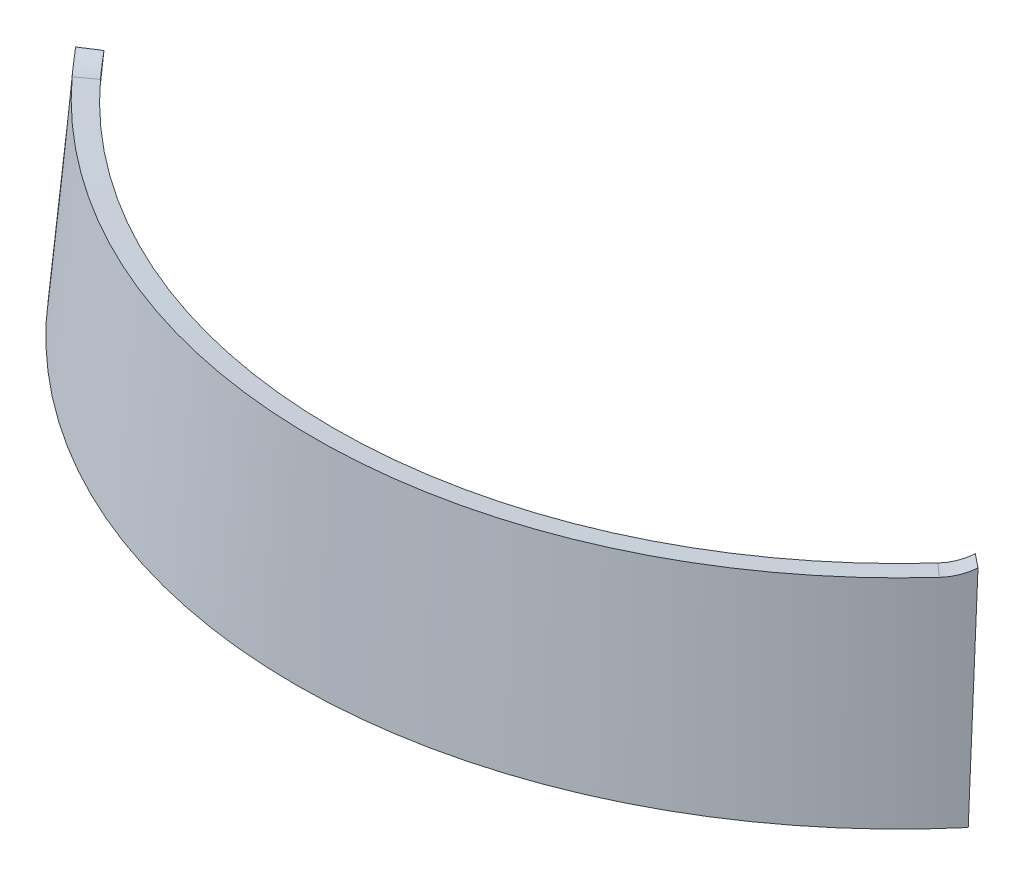
ISO-10303-21;
HEADER;
FILE_DESCRIPTION(('STEP AP214'),'2;1');
FILE_NAME('part.step','',(''),(''),'','','');
FILE_SCHEMA(('AUTOMOTIVE_DESIGN { 1 0 10303 214 1 1 1 1 }'));
ENDSEC;
DATA;
#1=APPLICATION_CONTEXT('core data for automotive mechanical design processes');
#2=APPLICATION_PROTOCOL_DEFINITION('international standard','automotive_design',2000,#1);
#3=PRODUCT_CONTEXT('',#1,'mechanical');
#4=PRODUCT('Part','Part','',(#3));
#5=PRODUCT_RELATED_PRODUCT_CATEGORY('part','',(#4));
#6=PRODUCT_DEFINITION_FORMATION('','',#4);
#7=PRODUCT_DEFINITION_CONTEXT('part definition',#1,'design');
#8=PRODUCT_DEFINITION('design','',#6,#7);
#9=PRODUCT_DEFINITION_SHAPE('','',#8);
#10=(LENGTH_UNIT() NAMED_UNIT(*) SI_UNIT(.MILLI.,.METRE.));
#11=(NAMED_UNIT(*) PLANE_ANGLE_UNIT() SI_UNIT($,.RADIAN.));
#12=(NAMED_UNIT(*) SI_UNIT($,.STERADIAN.) SOLID_ANGLE_UNIT());
#13=UNCERTAINTY_MEASURE_WITH_UNIT(LENGTH_MEASURE(1.E-05),#10,'distance_accuracy_value','');
#14=(GEOMETRIC_REPRESENTATION_CONTEXT(3) GLOBAL_UNCERTAINTY_ASSIGNED_CONTEXT((#13)) GLOBAL_UNIT_ASSIGNED_CONTEXT((#10,
#11,#12)) REPRESENTATION_CONTEXT('',''));
#15=CARTESIAN_POINT('',(0.,0.,0.));
#16=DIRECTION('',(0.,0.,1.));
#17=DIRECTION('',(1.,0.,0.));
#18=AXIS2_PLACEMENT_3D('',#15,#16,#17);
#19=CARTESIAN_POINT('',(58.3,-59.3935778713701,-83.337));
#20=DIRECTION('',(0.,-1.,0.));
#21=DIRECTION('',(0.,0.,-1.));
#22=AXIS2_PLACEMENT_3D('',#19,#20,#21);
#23=CONICAL_SURFACE('',#22,14.4850002191191,0.0872664625997009);
#24=CARTESIAN_POINT('',(69.3358035425654,-59.3935778713701,-73.9547683082445));
#25=CARTESIAN_POINT('',(69.3278254439968,-59.2081544183625,-73.9704296287934));
#26=CARTESIAN_POINT('',(69.3198754261002,-59.022733099519,-73.9861308660555));
#27=CARTESIAN_POINT('',(69.304057985451,-58.6518968010558,-74.017645272451));
#28=CARTESIAN_POINT('',(69.2961905625463,-58.466481821425,-74.0334584413782));
#29=CARTESIAN_POINT('',(69.2811196343292,-58.1088285409578,-74.0641006088641));
#30=CARTESIAN_POINT('',(69.2739086621952,-57.9365897108178,-74.0789197369238));
#31=CARTESIAN_POINT('',(69.2596113194375,-57.5921208480425,-74.108719532648));
#32=CARTESIAN_POINT('',(69.2525249488231,-57.4198908154078,-74.1237002003246));
#33=CARTESIAN_POINT('',(69.2313665790193,-56.9032088408956,-74.1687851908158));
#34=CARTESIAN_POINT('',(69.2173953329085,-56.5587652869665,-74.1990324783015));
#35=CARTESIAN_POINT('',(69.1961715909945,-56.0420877292742,-74.2441349558342));
#36=CARTESIAN_POINT('',(69.1890525384911,-55.869860003387,-74.259124358543));
#37=CARTESIAN_POINT('',(69.1746899767129,-55.5253981906983,-74.2889701613383));
#38=CARTESIAN_POINT('',(69.1674464674176,-55.3531641038958,-74.3038265614027));
#39=CARTESIAN_POINT('',(69.1528708069899,-55.0086917295785,-74.3334482550356));
#40=CARTESIAN_POINT('',(69.1455386557888,-54.8364534420606,-74.3482135485335));
#41=CARTESIAN_POINT('',(69.1308083099753,-54.4919742102006,-74.3776795504364));
#42=CARTESIAN_POINT('',(69.1234101153807,-54.3197332658594,-74.3923802588588));
#43=CARTESIAN_POINT('',(69.115990193567,-54.1474916520135,-74.4070619452131));
#44=B_SPLINE_CURVE_WITH_KNOTS('',3,(#24,#25,#26,#27,#28,#29,#30,#31,#32,#33,#34,#35,#36,#37,#38,
#39,#40,#41,#42,#43),.UNSPECIFIED.,.F.,.F.,(4,2,2,2,2,2,2,2,2,4),(0.,0.558763899898787,
1.11752677006218,1.63660312289222,2.15567951426087,3.19383309429425,3.71290889291727,
4.23198477770737,4.75106106518763,5.2701372133416),.UNSPECIFIED.);
#45=CARTESIAN_POINT('',(69.3358035425856,-59.3935778713684,-73.9547683082263));
#46=VERTEX_POINT('',#45);
#47=CARTESIAN_POINT('',(69.1159901935664,-54.1474916520136,-74.4070619452123));
#48=VERTEX_POINT('',#47);
#49=EDGE_CURVE('E162',#46,#48,#44,.T.);
#50=ORIENTED_EDGE('',*,*,#49,.F.);
#51=CARTESIAN_POINT('',(58.3,-59.3935778713668,-83.337));
#52=DIRECTION('',(0.,1.,0.));
#53=DIRECTION('',(-0.761854898052408,0.,0.647747724282807));
#54=AXIS2_PLACEMENT_3D('',#51,#52,#53);
#55=CIRCLE('',#54,14.4850002191197);
#56=CARTESIAN_POINT('',(47.2645316983138,-59.3935763446305,-73.9543742033071));
#57=VERTEX_POINT('',#56);
#58=EDGE_CURVE('E88',#57,#46,#55,.T.);
#59=ORIENTED_EDGE('',*,*,#58,.F.);
#60=CARTESIAN_POINT('',(47.4840410216355,-54.1472884243641,-74.4070520640063));
#61=CARTESIAN_POINT('',(47.4762288302436,-54.3328111733335,-74.3910207160033));
#62=CARTESIAN_POINT('',(47.4683394030358,-54.5183393050994,-74.375090755471));
#63=CARTESIAN_POINT('',(47.4525193306691,-54.8893995654095,-74.3432975043379));
#64=CARTESIAN_POINT('',(47.4445886855037,-55.0749316939544,-74.3274342137474));
#65=CARTESIAN_POINT('',(47.4287994293599,-55.4459932163226,-74.2956381942466));
#66=CARTESIAN_POINT('',(47.4209408184184,-55.6315226101446,-74.2797054653005));
#67=CARTESIAN_POINT('',(47.405434893005,-56.0025699856358,-74.2476059316552));
#68=CARTESIAN_POINT('',(47.3977875785231,-56.1880879673054,-74.231439126967));
#69=CARTESIAN_POINT('',(47.3798967557662,-56.6252512200588,-74.1932104178857));
#70=CARTESIAN_POINT('',(47.3696995639063,-56.8768942435226,-74.1711014777819));
#71=CARTESIAN_POINT('',(47.3542996040209,-57.254367601149,-74.1380870001985));
#72=CARTESIAN_POINT('',(47.3491489221781,-57.3801935208312,-74.1271069967157));
#73=CARTESIAN_POINT('',(47.3387625088909,-57.6318512626583,-74.1052554680019));
#74=CARTESIAN_POINT('',(47.3335267774617,-57.7576830848021,-74.0943839427513));
#75=CARTESIAN_POINT('',(47.3177077097769,-58.1351864638156,-74.0619122059468));
#76=CARTESIAN_POINT('',(47.3070125149735,-58.3868655686079,-74.040454865262));
#77=CARTESIAN_POINT('',(47.2856598393778,-58.8902246435601,-73.9975250037979));
#78=CARTESIAN_POINT('',(47.2750023586706,-59.1419046137207,-73.9760524829845));
#79=CARTESIAN_POINT('',(47.2645317618514,-59.3935748178942,-73.9543743347868));
#80=B_SPLINE_CURVE_WITH_KNOTS('',3,(#60,#61,#62,#63,#64,#65,#66,#67,#68,#69,#70,#71,#72,#73,#74,
#75,#76,#77,#78,#79),.UNSPECIFIED.,.F.,.F.,(4,2,2,2,2,2,2,2,2,4),(0.,0.559133523831722,
1.1182671351707,1.67740103398555,2.23653490659354,2.99498925711462,3.37421641269476,
3.75344349955008,4.51189877232273,5.27035575500386),.UNSPECIFIED.);
#81=CARTESIAN_POINT('',(47.4840342655292,-54.1474488852611,-74.407038197131));
#82=VERTEX_POINT('',#81);
#83=EDGE_CURVE('E86',#82,#57,#80,.T.);
#84=ORIENTED_EDGE('',*,*,#83,.F.);
#85=CARTESIAN_POINT('',(47.4839237497308,-54.1473506355896,-74.4071855567713));
#86=CARTESIAN_POINT('',(47.5029455469849,-54.1642915044753,-74.3818157854818));
#87=CARTESIAN_POINT('',(47.5226190392376,-54.1798309830475,-74.3560216232284));
#88=CARTESIAN_POINT('',(47.5630832073092,-54.2081477801977,-74.303837424383));
#89=CARTESIAN_POINT('',(47.5838729736652,-54.2209273060048,-74.2774478827322));
#90=CARTESIAN_POINT('',(47.6279955313779,-54.2446415568394,-74.2223086545942));
#91=CARTESIAN_POINT('',(47.6514024858307,-54.2553685683181,-74.1935293324321));
#92=CARTESIAN_POINT('',(47.6991530615057,-54.2737792228586,-74.1357528868523));
#93=CARTESIAN_POINT('',(47.7234971409555,-54.2814613557788,-74.1067556626097));
#94=CARTESIAN_POINT('',(47.7736296113362,-54.2939388824095,-74.0479702507079));
#95=CARTESIAN_POINT('',(47.799439307796,-54.2986491693966,-74.0181822192949));
#96=CARTESIAN_POINT('',(47.8517056582418,-54.3049019665824,-73.9587979989549));
#97=CARTESIAN_POINT('',(47.8781628157602,-54.3064419265174,-73.9292019835493));
#98=CARTESIAN_POINT('',(47.9048424092805,-54.306422128634,-73.8998191419885));
#99=B_SPLINE_CURVE_WITH_KNOTS('',3,(#85,#86,#87,#88,#89,#90,#91,#92,#93,#94,#95,#96,#97,#98),
.UNSPECIFIED.,.F.,.F.,(4,2,2,2,2,2,4),(0.,0.107792435970716,0.215498344754158,0.331209552811007,
0.446978077543321,0.565927150362218,0.684971870455319),.UNSPECIFIED.);
#100=CARTESIAN_POINT('',(47.9048424092813,-54.3064221286304,-73.8998191419883));
#101=VERTEX_POINT('',#100);
#102=EDGE_CURVE('E24',#82,#101,#99,.T.);
#103=ORIENTED_EDGE('',*,*,#102,.T.);
#104=CARTESIAN_POINT('',(58.3,-54.3064221286268,-83.337));
#105=DIRECTION('',(0.,1.,0.));
#106=DIRECTION('',(-0.740399438323832,0.,0.672167145678628));
#107=AXIS2_PLACEMENT_3D('',#104,#105,#106);
#108=CIRCLE('',#107,14.0399317620397);
#109=CARTESIAN_POINT('',(68.6951575964687,-54.3064221286267,-73.8998191483213));
#110=VERTEX_POINT('',#109);
#111=EDGE_CURVE('E188',#101,#110,#108,.T.);
#112=ORIENTED_EDGE('',*,*,#111,.T.);
#113=CARTESIAN_POINT('',(68.6951575964682,-54.3064221286267,-73.8998191483217));
#114=CARTESIAN_POINT('',(68.7222247042246,-54.3064413533519,-73.9296287306348));
#115=CARTESIAN_POINT('',(68.7490638326719,-54.3048555116502,-73.9596589626375));
#116=CARTESIAN_POINT('',(68.8020703407169,-54.2984165120459,-74.019911881253));
#117=CARTESIAN_POINT('',(68.8282382959003,-54.2935662580097,-74.0501343731928));
#118=CARTESIAN_POINT('',(68.8773217391302,-54.281151973593,-74.10774375126));
#119=CARTESIAN_POINT('',(68.900312168743,-54.2738849570193,-74.1351308729946));
#120=CARTESIAN_POINT('',(68.9454613768772,-54.2566376495181,-74.1897160229447));
#121=CARTESIAN_POINT('',(68.9676205091897,-54.2466585280897,-74.2169141274947));
#122=CARTESIAN_POINT('',(69.0115567859944,-54.2236352271577,-74.2716721861941));
#123=CARTESIAN_POINT('',(69.0333072472861,-54.2105152218121,-74.2992219315312));
#124=CARTESIAN_POINT('',(69.0756066499725,-54.1812744067909,-74.3536899738121));
#125=CARTESIAN_POINT('',(69.0961543945257,-54.1651506726031,-74.3806076263246));
#126=CARTESIAN_POINT('',(69.1159901935657,-54.1474916520142,-74.4070619452114));
#127=B_SPLINE_CURVE_WITH_KNOTS('',3,(#113,#114,#115,#116,#117,#118,#119,#120,#121,#122,#123,
#124,#125,#126),.UNSPECIFIED.,.F.,.F.,(4,2,2,2,2,2,4),(0.,0.120775992712592,0.241444690579032,
0.350801760817208,0.460111749302712,0.572388002950398,0.684774148610695),.UNSPECIFIED.);
#128=EDGE_CURVE('E157',#110,#48,#127,.T.);
#129=ORIENTED_EDGE('',*,*,#128,.T.);
#130=EDGE_LOOP('',(#50,#59,#84,#103,#112,#129));
#131=FACE_BOUND('',#130,.T.);
#132=ADVANCED_FACE('F17',(#131),#23,.F.);
#133=CARTESIAN_POINT('',(47.49866165339,-54.14282071276,-74.43629063863));
#134=CARTESIAN_POINT('',(47.35546964124,-54.12658763615,-74.31829503079));
#135=CARTESIAN_POINT('',(47.21227762908,-54.11035455955,-74.20029942295));
#136=CARTESIAN_POINT('',(47.06908561693,-54.09412148294,-74.08230381511));
#137=CARTESIAN_POINT('',(47.50129625758,-54.14524329011,-74.4327601891));
#138=CARTESIAN_POINT('',(47.35814135449,-54.12901021503,-74.31471957698));
#139=CARTESIAN_POINT('',(47.21498645141,-54.11277713996,-74.19667896487));
#140=CARTESIAN_POINT('',(47.07183154832,-54.09654406489,-74.07863835275));
#141=CARTESIAN_POINT('',(47.54204445549,-54.18212421184,-74.37828670634));
#142=CARTESIAN_POINT('',(47.39946292522,-54.16589115793,-74.25955134016));
#143=CARTESIAN_POINT('',(47.25688139494,-54.14965810402,-74.14081597399));
#144=CARTESIAN_POINT('',(47.11429986467,-54.13342505011,-74.02208060782));
#145=CARTESIAN_POINT('',(47.62686881689,-54.24145863301,-74.26879254677));
#146=CARTESIAN_POINT('',(47.48546385033,-54.22522555237,-74.14865016815));
#147=CARTESIAN_POINT('',(47.34405888376,-54.20899247172,-74.02850778952));
#148=CARTESIAN_POINT('',(47.2026539172,-54.19275939108,-73.9083654109));
#149=CARTESIAN_POINT('',(47.76808444808,-54.29615050013,-74.09776282732));
#150=CARTESIAN_POINT('',(47.62859804782,-54.27991742976,-73.9753965471));
#151=CARTESIAN_POINT('',(47.48911164756,-54.26368435939,-73.85303026688));
#152=CARTESIAN_POINT('',(47.3496252473,-54.24745128902,-73.73066398666));
#153=CARTESIAN_POINT('',(47.87490546618,-54.30935962691,-73.97622827808));
#154=CARTESIAN_POINT('',(47.7368450353,-54.29312655493,-73.85226276934));
#155=CARTESIAN_POINT('',(47.59878460443,-54.27689348295,-73.7282972606));
#156=CARTESIAN_POINT('',(47.46072417356,-54.26066041098,-73.60433175186));
#157=CARTESIAN_POINT('',(47.93293964588,-54.30896067019,-73.91241988732));
#158=CARTESIAN_POINT('',(47.79564742111,-54.29272759765,-73.78760904158));
#159=CARTESIAN_POINT('',(47.65835519634,-54.27649452512,-73.66279819583));
#160=CARTESIAN_POINT('',(47.52106297157,-54.26026145259,-73.53798735009));
#161=CARTESIAN_POINT('',(47.93616740072,-54.30891632902,-73.90887748992));
#162=CARTESIAN_POINT('',(47.79891788321,-54.29268325646,-73.78401969699));
#163=CARTESIAN_POINT('',(47.6616683657,-54.2764501839,-73.65916190406));
#164=CARTESIAN_POINT('',(47.52441884818,-54.26021711133,-73.53430411113));
#165=B_SPLINE_SURFACE_WITH_KNOTS('',3,3,((#133,#134,#135,#136),(#137,#138,#139,#140),(#141,#142,
#143,#144),(#145,#146,#147,#148),(#149,#150,#151,#152),(#153,#154,#155,#156),(#157,#158,#159,
#160),(#161,#162,#163,#164)),.UNSPECIFIED.,.F.,.F.,.F.,(4,1,1,1,1,4),(4,4),(0.206989552427,
0.2203666454819,0.4128770567948,0.6053874681078,0.7978978794207,0.8091998105001),
(0.3067286010984,0.6932713250124),.UNSPECIFIED.);
#166=CARTESIAN_POINT('',(47.5360507043638,-54.2628442572614,-73.5650152478724));
#167=CARTESIAN_POINT('',(47.5070678673985,-54.2628667672145,-73.5969342815541));
#168=CARTESIAN_POINT('',(47.4783330896156,-54.2611709628598,-73.6290948539875));
#169=CARTESIAN_POINT('',(47.421550154133,-54.2542744411859,-73.6936782619392));
#170=CARTESIAN_POINT('',(47.3935024176215,-54.2490716270109,-73.7261012428873));
#171=CARTESIAN_POINT('',(47.3422767492567,-54.2360951286395,-73.7862992131596));
#172=CARTESIAN_POINT('',(47.3189773481617,-54.2287972228289,-73.8140738468884));
#173=CARTESIAN_POINT('',(47.273183049476,-54.2115760124794,-73.8694506685729));
#174=CARTESIAN_POINT('',(47.2506877674617,-54.2016539820328,-73.8970529335794));
#175=CARTESIAN_POINT('',(47.2060895186944,-54.1788390232417,-73.9525929610576));
#176=CARTESIAN_POINT('',(47.1840100645715,-54.1658786050726,-73.9805221031898));
#177=CARTESIAN_POINT('',(47.1409996131213,-54.1370370695421,-74.0357996564438));
#178=CARTESIAN_POINT('',(47.120069816095,-54.1211529722367,-74.0631474430076));
#179=CARTESIAN_POINT('',(47.0998195769672,-54.1037732585963,-74.0900657108391));
#180=B_SPLINE_CURVE_WITH_KNOTS('',3,(#166,#167,#168,#169,#170,#171,#172,#173,#174,#175,#176,
#177,#178,#179),.UNSPECIFIED.,.F.,.F.,(4,2,2,2,2,2,4),(0.,0.129325554555336,0.258728502064069,
0.369571014512206,0.480359808042097,0.593892320507051,0.707541197669691),.UNSPECIFIED.);
#181=CARTESIAN_POINT('',(47.5360505864559,-54.2628442572569,-73.5650153777482));
#182=VERTEX_POINT('',#181);
#183=CARTESIAN_POINT('',(47.0999336781498,-54.1038710141412,-74.089914080989));
#184=VERTEX_POINT('',#183);
#185=EDGE_CURVE('E187',#182,#184,#180,.T.);
#186=CARTESIAN_POINT('',(47.5360514118123,-54.2628442572523,-73.5650144686047));
#187=CARTESIAN_POINT('',(47.5514177800969,-54.2646600018929,-73.5789645788172));
#188=CARTESIAN_POINT('',(47.5667841278617,-54.2664757465335,-73.5929147116328));
#189=CARTESIAN_POINT('',(47.5975167852724,-54.2701072358147,-73.6208150192521));
#190=CARTESIAN_POINT('',(47.6128830949185,-54.2719229804553,-73.6347651940559));
#191=CARTESIAN_POINT('',(47.6436156790133,-54.2755544697365,-73.6626655824336));
#192=CARTESIAN_POINT('',(47.6589819534621,-54.2773702143772,-73.6766157960075));
#193=CARTESIAN_POINT('',(47.6897144554812,-54.2810017036584,-73.7045162747924));
#194=CARTESIAN_POINT('',(47.7050806830515,-54.282817448299,-73.7184665400034));
#195=CARTESIAN_POINT('',(47.7362147527422,-54.286496394234,-73.7467316774264));
#196=CARTESIAN_POINT('',(47.7519825948587,-54.2883595955283,-73.7610465496427));
#197=CARTESIAN_POINT('',(47.7832505843989,-54.2920543603479,-73.7894331694938));
#198=CARTESIAN_POINT('',(47.7987507310001,-54.2938859238731,-73.8035049180345));
#199=CARTESIAN_POINT('',(47.829483316386,-54.2975174131543,-73.83140530499));
#200=CARTESIAN_POINT('',(47.8447157545465,-54.2993173389103,-73.8452339440924));
#201=CARTESIAN_POINT('',(47.874912925098,-54.3028855526532,-73.8726481099165));
#202=CARTESIAN_POINT('',(47.8898776568069,-54.3046538406401,-73.8862336373896));
#203=CARTESIAN_POINT('',(47.9048424092821,-54.3064221286269,-73.8998191419881));
#204=B_SPLINE_CURVE_WITH_KNOTS('',3,(#186,#187,#188,#189,#190,#191,#192,#193,#194,#195,#196,
#197,#198,#199,#200,#201,#202,#203),.UNSPECIFIED.,.F.,.F.,(4,2,2,2,2,2,2,2,4),(0.,
0.0625000000014957,0.125000000002516,0.187500000003562,0.250000000005036,0.314133512116847,
0.377178016154641,0.439133512118844,0.500000000009961),.UNSPECIFIED.);
#205=EDGE_CURVE('E83',#182,#101,#204,.T.);
#206=CARTESIAN_POINT('',(47.0999336803682,-54.1038710143917,-74.0899140828206));
#207=CARTESIAN_POINT('',(47.1357053226429,-54.1079294617564,-74.1194481445009));
#208=CARTESIAN_POINT('',(47.1714769649176,-54.1119879091211,-74.1489822061812));
#209=CARTESIAN_POINT('',(47.2430202494668,-54.1201048038509,-74.2080503295419));
#210=CARTESIAN_POINT('',(47.2787918917414,-54.1241632512159,-74.2375843912223));
#211=CARTESIAN_POINT('',(47.3710687813788,-54.1346324630218,-74.313770754972));
#212=CARTESIAN_POINT('',(47.4275740287415,-54.1410432274631,-74.3604230570415));
#213=CARTESIAN_POINT('',(47.4840792761035,-54.1474539919052,-74.4070753591116));
#214=B_SPLINE_CURVE_WITH_KNOTS('',3,(#206,#207,#208,#209,#210,#211,#212,#213),.UNSPECIFIED.,.F.,
.F.,(4,2,2,4),(0.,0.139696383877267,0.279392767754503,0.500058586397932),.UNSPECIFIED.);
#215=EDGE_CURVE('E80',#184,#82,#214,.T.);
#216=ORIENTED_EDGE('',*,*,#185,.F.);
#217=ORIENTED_EDGE('',*,*,#205,.T.);
#218=ORIENTED_EDGE('',*,*,#102,.F.);
#219=ORIENTED_EDGE('',*,*,#215,.F.);
#220=EDGE_LOOP('',(#216,#217,#218,#219));
#221=FACE_BOUND('',#220,.T.);
#222=ADVANCED_FACE('F78',(#221),#165,.F.);
#223=CARTESIAN_POINT('',(47.50901228822,-54.09761392571,-74.43036734651));
#224=CARTESIAN_POINT('',(47.36584777773,-54.08137329344,-74.31220265738));
#225=CARTESIAN_POINT('',(47.22268326725,-54.06513266118,-74.19403796825));
#226=CARTESIAN_POINT('',(47.07951875677,-54.04889202891,-74.07587327912));
#227=CARTESIAN_POINT('',(47.5082791736,-54.11508838487,-74.42885823734));
#228=CARTESIAN_POINT('',(47.36511980554,-54.09884766802,-74.31068579934));
#229=CARTESIAN_POINT('',(47.22196043747,-54.08260695117,-74.19251336134));
#230=CARTESIAN_POINT('',(47.0788010694,-54.06636623432,-74.07434092334));
#231=CARTESIAN_POINT('',(47.48284844713,-54.72055586039,-74.37660040719));
#232=CARTESIAN_POINT('',(47.33986804891,-54.70431234841,-74.25816098834));
#233=CARTESIAN_POINT('',(47.19688765069,-54.68806883644,-74.13972156949));
#234=CARTESIAN_POINT('',(47.05390725247,-54.67182532447,-74.02128215064));
#235=CARTESIAN_POINT('',(47.43098997216,-55.910590408,-74.2758651083));
#236=CARTESIAN_POINT('',(47.28841413433,-55.89435034868,-74.15699980953));
#237=CARTESIAN_POINT('',(47.1458382965,-55.87811028936,-74.03813451076));
#238=CARTESIAN_POINT('',(47.00326245866,-55.86187023005,-73.91926921199));
#239=CARTESIAN_POINT('',(47.3612980963,-57.65908009802,-74.12086258553));
#240=CARTESIAN_POINT('',(47.21934436836,-57.64284025142,-74.00125886501));
#241=CARTESIAN_POINT('',(47.07739064041,-57.62660040482,-73.88165514448));
#242=CARTESIAN_POINT('',(46.93543691247,-57.61036055822,-73.76205142395));
#243=CARTESIAN_POINT('',(47.31042653596,-58.83585042074,-74.02182124519));
#244=CARTESIAN_POINT('',(47.16879408879,-58.81960654469,-73.90176679616));
#245=CARTESIAN_POINT('',(47.02716164161,-58.80336266864,-73.78171234713));
#246=CARTESIAN_POINT('',(46.88552919444,-58.78711879259,-73.66165789811));
#247=CARTESIAN_POINT('',(47.28557198541,-59.43115899253,-73.97048941471));
#248=CARTESIAN_POINT('',(47.14415860975,-59.41491830082,-73.8502335197));
#249=CARTESIAN_POINT('',(47.00274523409,-59.3986776091,-73.72997762468));
#250=CARTESIAN_POINT('',(46.86133185843,-59.38243691739,-73.60972172967));
#251=CARTESIAN_POINT('',(47.28484232368,-59.4486551091,-73.96897963936));
#252=CARTESIAN_POINT('',(47.14343543768,-59.43241451567,-73.84871784726));
#253=CARTESIAN_POINT('',(47.00202855168,-59.41617392223,-73.72845605515));
#254=CARTESIAN_POINT('',(46.86062166567,-59.3999333288,-73.60819426304));
#255=B_SPLINE_SURFACE_WITH_KNOTS('',3,3,((#223,#224,#225,#226),(#227,#228,#229,#230),(#231,#232,
#233,#234),(#235,#236,#237,#238),(#239,#240,#241,#242),(#243,#244,#245,#246),(#247,#248,#249,
#250),(#251,#252,#253,#254)),.UNSPECIFIED.,.F.,.F.,.F.,(4,1,1,1,1,4),(4,4),(0.03203523281385,
0.04111895044176,0.3468003726751,0.6524817949085,0.9581632171418,0.9674201014717),
(0.306542843676,0.6932713753543),.UNSPECIFIED.);
#256=CARTESIAN_POINT('',(46.8850537311856,-59.3500000001638,-73.6317326487801));
#257=CARTESIAN_POINT('',(46.9204168597358,-59.3540609740616,-73.6617992482069));
#258=CARTESIAN_POINT('',(46.9557799882857,-59.3581219479595,-73.691865847634));
#259=CARTESIAN_POINT('',(47.0265062453854,-59.3662438957551,-73.7519990464886));
#260=CARTESIAN_POINT('',(47.0618693739351,-59.3703048696529,-73.7820656459161));
#261=CARTESIAN_POINT('',(47.1530119963304,-59.3807713590645,-73.8595573394033));
#262=CARTESIAN_POINT('',(47.208791490176,-59.3871768745783,-73.906982433463));
#263=CARTESIAN_POINT('',(47.2645709840224,-59.3935823900921,-73.954407527522));
#264=B_SPLINE_CURVE_WITH_KNOTS('',3,(#256,#257,#258,#259,#260,#261,#262,#263),.UNSPECIFIED.,.F.,
.F.,(4,2,2,4),(0.,0.139783350004785,0.279566700009595,0.500051844595891),.UNSPECIFIED.);
#265=CARTESIAN_POINT('',(46.8849749986281,-59.3499984631999,-73.6318254584485));
#266=VERTEX_POINT('',#265);
#267=EDGE_CURVE('E92',#266,#57,#264,.T.);
#268=CARTESIAN_POINT('',(47.0999400331399,-54.1037167267381,-74.0899275808074));
#269=CARTESIAN_POINT('',(47.0922953248626,-54.2892289511036,-74.0736948339414));
#270=CARTESIAN_POINT('',(47.0845700976722,-54.474746961953,-74.0575676994378));
#271=CARTESIAN_POINT('',(47.0690758324073,-54.8457873015414,-74.0253838027863));
#272=CARTESIAN_POINT('',(47.0613067943259,-55.0313096302812,-74.0093270406496));
#273=CARTESIAN_POINT('',(47.0458421326412,-55.4023513895955,-73.9771430329331));
#274=CARTESIAN_POINT('',(47.0381465090767,-55.5878708201684,-73.9610157873161));
#275=CARTESIAN_POINT('',(47.0229727720224,-55.9588974965848,-73.9285204965951));
#276=CARTESIAN_POINT('',(47.0154946585231,-56.1444047424288,-73.9121524515017));
#277=CARTESIAN_POINT('',(46.9980048783917,-56.5815652107842,-73.8734444608926));
#278=CARTESIAN_POINT('',(46.9880407024062,-56.833216039477,-73.8510563793326));
#279=CARTESIAN_POINT('',(46.9729851349576,-57.2107017741041,-73.817630120684));
#280=CARTESIAN_POINT('',(46.9679483954014,-57.3365319300012,-73.806514012122));
#281=CARTESIAN_POINT('',(46.9577864024745,-57.5881985768051,-73.7843946177131));
#282=CARTESIAN_POINT('',(46.9526611491212,-57.7140350677108,-73.7733913318443));
#283=CARTESIAN_POINT('',(46.9371688182205,-58.0915530545995,-73.7405301935137));
#284=CARTESIAN_POINT('',(46.9266851860513,-58.3432426573091,-73.7188210964394));
#285=CARTESIAN_POINT('',(46.9057548962458,-58.8466228633725,-73.6753895977375));
#286=CARTESIAN_POINT('',(46.8953082387004,-59.0983134667273,-73.6536671960774));
#287=CARTESIAN_POINT('',(46.8850539887345,-59.3499936440686,-73.6317332013084));
#288=B_SPLINE_CURVE_WITH_KNOTS('',3,(#268,#269,#270,#271,#272,#273,#274,#275,#276,#277,#278,
#279,#280,#281,#282,#283,#284,#285,#286,#287),.UNSPECIFIED.,.F.,.F.,(4,2,2,2,2,2,2,2,2,4),(0.,
0.559133539850394,1.11826716859833,1.67740109275695,2.23653499262418,2.99505846936875,
3.37432018216237,3.75358182081141,4.51210632619713,5.27063269293057),.UNSPECIFIED.);
#289=EDGE_CURVE('E96',#184,#266,#288,.T.);
#290=ORIENTED_EDGE('',*,*,#215,.T.);
#291=ORIENTED_EDGE('',*,*,#83,.T.);
#292=ORIENTED_EDGE('',*,*,#267,.F.);
#293=ORIENTED_EDGE('',*,*,#289,.F.);
#294=EDGE_LOOP('',(#290,#291,#292,#293));
#295=FACE_BOUND('',#294,.T.);
#296=ADVANCED_FACE('F94',(#295),#255,.T.);
#297=CARTESIAN_POINT('',(58.3,-59.3499999999925,-83.337));
#298=DIRECTION('',(0.,1.,0.));
#299=DIRECTION('',(0.,0.,1.));
#300=AXIS2_PLACEMENT_3D('',#297,#298,#299);
#301=CONICAL_SURFACE('',#300,14.9830975681693,1.4835298641949);
#302=DIRECTION('',(-0.758978861722535,-0.0871557427438048,-0.645255735321385));
#303=VECTOR('',#302,1.);
#304=CARTESIAN_POINT('',(69.5255482579946,-59.3717889356856,-73.7934543744134));
#305=LINE('',#304,#303);
#306=CARTESIAN_POINT('',(69.7152929734215,-59.3499999999997,-73.6321404405799));
#307=VERTEX_POINT('',#306);
#308=EDGE_CURVE('E168',#307,#46,#305,.T.);
#309=ORIENTED_EDGE('',*,*,#308,.F.);
#310=CARTESIAN_POINT('',(58.3,-59.3499999999999,-83.337));
#311=DIRECTION('',(0.,-1.,0.));
#312=DIRECTION('',(0.,0.,-1.));
#313=AXIS2_PLACEMENT_3D('',#310,#311,#312);
#314=CIRCLE('',#313,14.9830975681683);
#315=EDGE_CURVE('E180',#266,#307,#314,.F.);
#316=ORIENTED_EDGE('',*,*,#315,.F.);
#317=ORIENTED_EDGE('',*,*,#267,.T.);
#318=ORIENTED_EDGE('',*,*,#58,.T.);
#319=EDGE_LOOP('',(#309,#316,#317,#318));
#320=FACE_BOUND('',#319,.T.);
#321=ADVANCED_FACE('F115',(#320),#301,.T.);
#322=CARTESIAN_POINT('',(69.31576647949,-59.44864229823,-73.9692953507));
#323=CARTESIAN_POINT('',(69.45711315861,-59.43240922576,-73.84909545823));
#324=CARTESIAN_POINT('',(69.59845983772,-59.41617615329,-73.72889556575));
#325=CARTESIAN_POINT('',(69.73980651684,-59.39994308082,-73.60869567328));
#326=CARTESIAN_POINT('',(69.31501228596,-59.43114242454,-73.97077184923));
#327=CARTESIAN_POINT('',(69.45636425349,-59.41490935207,-73.85057817567));
#328=CARTESIAN_POINT('',(69.59771622102,-59.3986762796,-73.73038450211));
#329=CARTESIAN_POINT('',(69.73906818854,-59.38244320713,-73.61019082854));
#330=CARTESIAN_POINT('',(69.28934111335,-58.8353026226,-74.02105522914));
#331=CARTESIAN_POINT('',(69.43087329731,-58.81906955013,-73.90107350761));
#332=CARTESIAN_POINT('',(69.57240548128,-58.80283647766,-73.78109178608));
#333=CARTESIAN_POINT('',(69.71393766525,-58.78660340519,-73.66111006454));
#334=CARTESIAN_POINT('',(69.23916694441,-57.65797879368,-74.1211967816));
#335=CARTESIAN_POINT('',(69.38106601699,-57.64174572121,-74.00164834736));
#336=CARTESIAN_POINT('',(69.52296508957,-57.62551264874,-73.88209991312));
#337=CARTESIAN_POINT('',(69.66486416215,-57.60927957627,-73.76255147889));
#338=CARTESIAN_POINT('',(69.16881701454,-55.9094567913,-74.27540777078));
#339=CARTESIAN_POINT('',(69.31132759026,-55.89322371883,-74.15658888613));
#340=CARTESIAN_POINT('',(69.45383816598,-55.87699064636,-74.03777000148));
#341=CARTESIAN_POINT('',(69.5963487417,-55.86075757389,-73.91895111683));
#342=CARTESIAN_POINT('',(69.11801137597,-54.7201101197,-74.37714391841));
#343=CARTESIAN_POINT('',(69.26090801126,-54.70387704723,-74.2587904631));
#344=CARTESIAN_POINT('',(69.40380464656,-54.68764397476,-74.14043700779));
#345=CARTESIAN_POINT('',(69.54670128186,-54.67141090229,-74.02208355249));
#346=CARTESIAN_POINT('',(69.0919124072,-54.1150975904,-74.42867370565));
#347=CARTESIAN_POINT('',(69.23500421945,-54.09886451793,-74.31055668246));
#348=CARTESIAN_POINT('',(69.37809603169,-54.08263144546,-74.19243965927));
#349=CARTESIAN_POINT('',(69.52118784394,-54.06639837299,-74.07432263608));
#350=CARTESIAN_POINT('',(69.09115818359,-54.0976181913,-74.4301622807));
#351=CARTESIAN_POINT('',(69.23425563384,-54.08138511883,-74.31205208818));
#352=CARTESIAN_POINT('',(69.37735308409,-54.06515204636,-74.19394189566));
#353=CARTESIAN_POINT('',(69.52045053434,-54.04891897389,-74.07583170314));
#354=B_SPLINE_SURFACE_WITH_KNOTS('',3,3,((#322,#323,#324,#325),(#326,#327,#328,#329),(#330,#331,
#332,#333),(#334,#335,#336,#337),(#338,#339,#340,#341),(#342,#343,#344,#345),(#346,#347,#348,
#349),(#350,#351,#352,#353)),.UNSPECIFIED.,.F.,.F.,.F.,(4,1,1,1,1,4),(4,4),(0.03255055298784,
0.0418009074088,0.3474839928026,0.6531670781965,0.9588501635904,0.9679436598999),
(0.3067286225179,0.6932713734153),.UNSPECIFIED.);
#355=DIRECTION('',(0.768202711477072,0.087155742729794,0.634246380035781));
#356=VECTOR('',#355,1.);
#357=CARTESIAN_POINT('',(69.3080408714349,-54.1257027163285,-74.2485003502012));
#358=LINE('',#357,#356);
#359=CARTESIAN_POINT('',(69.5000915493049,-54.1039137806411,-74.0899387551907));
#360=VERTEX_POINT('',#359);
#361=EDGE_CURVE('E172',#48,#360,#358,.T.);
#362=CARTESIAN_POINT('',(69.7152929734219,-59.3499999999992,-73.6321404405734));
#363=CARTESIAN_POINT('',(69.7074658988694,-59.1645850820486,-73.6479782521319));
#364=CARTESIAN_POINT('',(69.6996683639149,-58.9791724608233,-73.6638579202704));
#365=CARTESIAN_POINT('',(69.6841597763162,-58.6083540383356,-73.6957342370916));
#366=CARTESIAN_POINT('',(69.6764487234986,-58.4229482370603,-73.7117308855395));
#367=CARTESIAN_POINT('',(69.6616836226974,-58.0653013834961,-73.7427340084873));
#368=CARTESIAN_POINT('',(69.6546217820963,-57.8930597629474,-73.7577301950766));
#369=CARTESIAN_POINT('',(69.6406280180708,-57.5485859717266,-73.7878908439875));
#370=CARTESIAN_POINT('',(69.6336960946564,-57.3763538010553,-73.8030553063224));
#371=CARTESIAN_POINT('',(69.6130060528982,-56.8596660238892,-73.8486983754528));
#372=CARTESIAN_POINT('',(69.5993536750718,-56.5152194467316,-73.8793266387026));
#373=CARTESIAN_POINT('',(69.5786018665765,-55.9985365811955,-73.9249947917156));
#374=CARTESIAN_POINT('',(69.5716390640465,-55.8263069688722,-73.9401717870276));
#375=CARTESIAN_POINT('',(69.5575856283619,-55.4818409621164,-73.9703893293752));
#376=CARTESIAN_POINT('',(69.5504949951851,-55.3096045676828,-73.985429876387));
#377=CARTESIAN_POINT('',(69.5362229417167,-54.9651273223619,-74.0154178475714));
#378=CARTESIAN_POINT('',(69.5290415213573,-54.7928864714713,-74.0303652716743));
#379=CARTESIAN_POINT('',(69.5146112620787,-54.4484019507231,-74.0601944210872));
#380=CARTESIAN_POINT('',(69.5073624231785,-54.2761582808661,-74.0750761464158));
#381=CARTESIAN_POINT('',(69.5000915546459,-54.1039139071951,-74.0899387442693));
#382=B_SPLINE_CURVE_WITH_KNOTS('',3,(#362,#363,#364,#365,#366,#367,#368,#369,#370,#371,#372,
#373,#374,#375,#376,#377,#378,#379,#380,#381),.UNSPECIFIED.,.F.,.F.,(4,2,2,2,2,2,2,2,2,4),(0.,
0.558763961131091,1.11752680133374,1.63663878955536,2.15575081854225,3.19397576406751,
3.71308717498376,4.23219867628681,4.75131056604463,5.27042230922829),.UNSPECIFIED.);
#383=EDGE_CURVE('E182',#307,#360,#382,.T.);
#384=ORIENTED_EDGE('',*,*,#308,.T.);
#385=ORIENTED_EDGE('',*,*,#49,.T.);
#386=ORIENTED_EDGE('',*,*,#361,.T.);
#387=ORIENTED_EDGE('',*,*,#383,.F.);
#388=EDGE_LOOP('',(#384,#385,#386,#387));
#389=FACE_BOUND('',#388,.T.);
#390=ADVANCED_FACE('F116',(#389),#354,.T.);
#391=CARTESIAN_POINT('',(68.66381578571,-54.30891672055,-73.90885818743));
#392=CARTESIAN_POINT('',(68.80106494157,-54.29268366377,-73.78400026506));
#393=CARTESIAN_POINT('',(68.93831409743,-54.27645060699,-73.65914234269));
#394=CARTESIAN_POINT('',(69.07556325329,-54.26021755021,-73.53428442032));
#395=CARTESIAN_POINT('',(68.66704936518,-54.30896099271,-73.91240726506));
#396=CARTESIAN_POINT('',(68.80434135617,-54.2927279302,-73.78759633228));
#397=CARTESIAN_POINT('',(68.94163334716,-54.27649486768,-73.66278539949));
#398=CARTESIAN_POINT('',(69.07892533815,-54.26026180516,-73.53797446671));
#399=CARTESIAN_POINT('',(68.72530968848,-54.30935841093,-73.97646922016));
#400=CARTESIAN_POINT('',(68.86337371545,-54.29312525406,-73.85250622423));
#401=CARTESIAN_POINT('',(69.00143774241,-54.27689209718,-73.72854322831));
#402=CARTESIAN_POINT('',(69.13950176938,-54.2606589403,-73.60458023238));
#403=CARTESIAN_POINT('',(68.83241257343,-54.29604886682,-74.09833832477));
#404=CARTESIAN_POINT('',(68.97190532218,-54.27981583309,-73.97597988002));
#405=CARTESIAN_POINT('',(69.11139807093,-54.26358279936,-73.85362143527));
#406=CARTESIAN_POINT('',(69.25089081968,-54.24734976563,-73.73126299052));
#407=CARTESIAN_POINT('',(68.97361543572,-54.24114338639,-74.26940795872));
#408=CARTESIAN_POINT('',(69.11502714869,-54.22491029965,-74.14927344654));
#409=CARTESIAN_POINT('',(69.25643886166,-54.2086772129,-74.02913893436));
#410=CARTESIAN_POINT('',(69.39785057463,-54.19244412615,-73.90900442218));
#411=CARTESIAN_POINT('',(69.05820609299,-54.18197225294,-74.37861108209));
#412=CARTESIAN_POINT('',(69.20079117515,-54.1657391887,-74.25987982573));
#413=CARTESIAN_POINT('',(69.3433762573,-54.14950612445,-74.14114856937));
#414=CARTESIAN_POINT('',(69.48596133945,-54.1332730602,-74.022417313));
#415=CARTESIAN_POINT('',(69.0987884678,-54.14523126613,-74.4328644934));
#416=CARTESIAN_POINT('',(69.24194449153,-54.12899819251,-74.31482526607));
#417=CARTESIAN_POINT('',(69.38510051526,-54.11276511889,-74.19678603873));
#418=CARTESIAN_POINT('',(69.52825653899,-54.09653204526,-74.0787468114));
#419=CARTESIAN_POINT('',(69.10145218963,-54.14278053128,-74.43643419487));
#420=CARTESIAN_POINT('',(69.2446457262,-54.12654745694,-74.31844047756));
#421=CARTESIAN_POINT('',(69.38783926278,-54.11031438259,-74.20044676026));
#422=CARTESIAN_POINT('',(69.53103279935,-54.09408130825,-74.08245304295));
#423=B_SPLINE_SURFACE_WITH_KNOTS('',3,3,((#391,#392,#393,#394),(#395,#396,#397,#398),(#399,#400,
#401,#402),(#403,#404,#405,#406),(#407,#408,#409,#410),(#411,#412,#413,#414),(#415,#416,#417,
#418),(#419,#420,#421,#422)),.UNSPECIFIED.,.F.,.F.,.F.,(4,1,1,1,1,4),(4,4),(0.1798434692922,
0.1912656898432,0.3862680849887,0.5812704801342,0.7762728752796,0.7900464022139),
(0.3067286070389,0.6932713369519),.UNSPECIFIED.);
#424=CARTESIAN_POINT('',(69.5000914953067,-54.1039138268886,-74.0899386834327));
#425=CARTESIAN_POINT('',(69.4798399314094,-54.1212865198541,-74.0630203055167));
#426=CARTESIAN_POINT('',(69.4589067837007,-54.1371530433843,-74.0356714922851));
#427=CARTESIAN_POINT('',(69.4158862670187,-54.1659586571468,-73.9803880434319));
#428=CARTESIAN_POINT('',(69.3937999210166,-54.178900289432,-73.9524539397479));
#429=CARTESIAN_POINT('',(69.3476584043857,-54.2024755705589,-73.8949973929213));
#430=CARTESIAN_POINT('',(69.3235593726423,-54.2129835038555,-73.8654589201301));
#431=CARTESIAN_POINT('',(69.274454288168,-54.2310062812464,-73.8062003506201));
#432=CARTESIAN_POINT('',(69.2494478086193,-54.2385196964282,-73.776480174048));
#433=CARTESIAN_POINT('',(69.1980342672474,-54.2506997384739,-73.7163009442845));
#434=CARTESIAN_POINT('',(69.1716077068123,-54.2552876507738,-73.6858426766053));
#435=CARTESIAN_POINT('',(69.1181643081936,-54.2613673166966,-73.6251773680961));
#436=CARTESIAN_POINT('',(69.091147954173,-54.2628615200234,-73.5949701473719));
#437=CARTESIAN_POINT('',(69.0639117925502,-54.2628442585084,-73.5649739378053));
#438=B_SPLINE_CURVE_WITH_KNOTS('',3,(#424,#425,#426,#427,#428,#429,#430,#431,#432,#433,#434,
#435,#436,#437),.UNSPECIFIED.,.F.,.F.,(4,2,2,2,2,2,4),(0.,0.113636458454781,0.227173771227951,
0.345677357182583,0.464237422704403,0.585866093464825,0.707398417615921),.UNSPECIFIED.);
#439=CARTESIAN_POINT('',(69.0639117924794,-54.2628442574713,-73.5649739378696));
#440=VERTEX_POINT('',#439);
#441=EDGE_CURVE('E36',#360,#440,#438,.T.);
#442=CARTESIAN_POINT('',(68.6951575964698,-54.3064221286267,-73.8998191483202));
#443=CARTESIAN_POINT('',(68.7105224071765,-54.3046063839861,-73.8858673224188));
#444=CARTESIAN_POINT('',(68.7258872113154,-54.3027906393455,-73.8719154892843));
#445=CARTESIAN_POINT('',(68.7566168064582,-54.2991591500644,-73.8440118085486));
#446=CARTESIAN_POINT('',(68.7719815974621,-54.2973434054239,-73.8300599609474));
#447=CARTESIAN_POINT('',(68.8027111663348,-54.2937119161428,-73.8021562512781));
#448=CARTESIAN_POINT('',(68.8180759442037,-54.2918961715022,-73.7882043892101));
#449=CARTESIAN_POINT('',(68.8488054868065,-54.2882646822211,-73.7603006506074));
#450=CARTESIAN_POINT('',(68.8641702515403,-54.2864489375806,-73.7463487740726));
#451=CARTESIAN_POINT('',(68.8948997678731,-54.2828174482995,-73.7184450065363));
#452=CARTESIAN_POINT('',(68.9102645194719,-54.2810017036589,-73.7044931155348));
#453=CARTESIAN_POINT('',(68.9409940095346,-54.2773702143778,-73.6765893190651));
#454=CARTESIAN_POINT('',(68.9563587479984,-54.2755544697373,-73.6626374135969));
#455=CARTESIAN_POINT('',(68.987088211791,-54.2719229804562,-73.6347335881936));
#456=CARTESIAN_POINT('',(69.0024529371197,-54.2701072358156,-73.6207816682587));
#457=CARTESIAN_POINT('',(69.0331823746422,-54.2664757465345,-73.592877813922));
#458=CARTESIAN_POINT('',(69.0485470868359,-54.264660001894,-73.5789258795204));
#459=CARTESIAN_POINT('',(69.0639117924617,-54.2628442572535,-73.5649739378857));
#460=B_SPLINE_CURVE_WITH_KNOTS('',3,(#442,#443,#444,#445,#446,#447,#448,#449,#450,#451,#452,
#453,#454,#455,#456,#457,#458,#459),.UNSPECIFIED.,.F.,.F.,(4,2,2,2,2,2,2,2,4),(0.,
0.0625000003499038,0.125000000702933,0.187500001059062,0.250000001418355,0.312500001780803,
0.375000002146407,0.437500002515195,0.500000002887194),.UNSPECIFIED.);
#461=EDGE_CURVE('E45',#110,#440,#460,.T.);
#462=ORIENTED_EDGE('',*,*,#441,.F.);
#463=ORIENTED_EDGE('',*,*,#361,.F.);
#464=ORIENTED_EDGE('',*,*,#128,.F.);
#465=ORIENTED_EDGE('',*,*,#461,.T.);
#466=EDGE_LOOP('',(#462,#463,#464,#465));
#467=FACE_BOUND('',#466,.T.);
#468=ADVANCED_FACE('F19',(#467),#423,.F.);
#469=CARTESIAN_POINT('',(58.3,-54.2628442572523,-83.337));
#470=DIRECTION('',(0.,1.,0.));
#471=DIRECTION('',(0.,0.,1.));
#472=AXIS2_PLACEMENT_3D('',#469,#470,#471);
#473=CONICAL_SURFACE('',#472,14.5380291110916,1.4835298641949);
#474=ORIENTED_EDGE('',*,*,#205,.F.);
#475=CARTESIAN_POINT('',(58.3,-54.2628442576892,-83.337));
#476=DIRECTION('',(0.,-1.,0.));
#477=DIRECTION('',(0.,0.,-1.));
#478=AXIS2_PLACEMENT_3D('',#475,#476,#477);
#479=CIRCLE('',#478,14.5380291111254);
#480=EDGE_CURVE('E11',#440,#182,#479,.T.);
#481=ORIENTED_EDGE('',*,*,#480,.F.);
#482=ORIENTED_EDGE('',*,*,#461,.F.);
#483=ORIENTED_EDGE('',*,*,#111,.F.);
#484=EDGE_LOOP('',(#474,#481,#482,#483));
#485=FACE_BOUND('',#484,.T.);
#486=ADVANCED_FACE('F149',(#485),#473,.F.);
#487=CARTESIAN_POINT('',(58.3,-59.3500000000001,-83.337));
#488=DIRECTION('',(0.,-1.,0.));
#489=DIRECTION('',(1.,0.,0.));
#490=AXIS2_PLACEMENT_3D('',#487,#488,#489);
#491=CONICAL_SURFACE('',#490,14.9830975681683,0.0872664625996996);
#492=ORIENTED_EDGE('',*,*,#480,.T.);
#493=ORIENTED_EDGE('',*,*,#185,.T.);
#494=ORIENTED_EDGE('',*,*,#289,.T.);
#495=ORIENTED_EDGE('',*,*,#315,.T.);
#496=ORIENTED_EDGE('',*,*,#383,.T.);
#497=ORIENTED_EDGE('',*,*,#441,.T.);
#498=EDGE_LOOP('',(#492,#493,#494,#495,#496,#497));
#499=FACE_BOUND('',#498,.T.);
#500=ADVANCED_FACE('F197',(#499),#491,.T.);
#501=CLOSED_SHELL('',(#132,#222,#296,#321,#390,#468,#486,#500));
#502=MANIFOLD_SOLID_BREP('B1',#501);
#503=ADVANCED_BREP_SHAPE_REPRESENTATION('',(#18,#502),#14);
#504=SHAPE_DEFINITION_REPRESENTATION(#9,#503);
ENDSEC;
END-ISO-10303-21;
